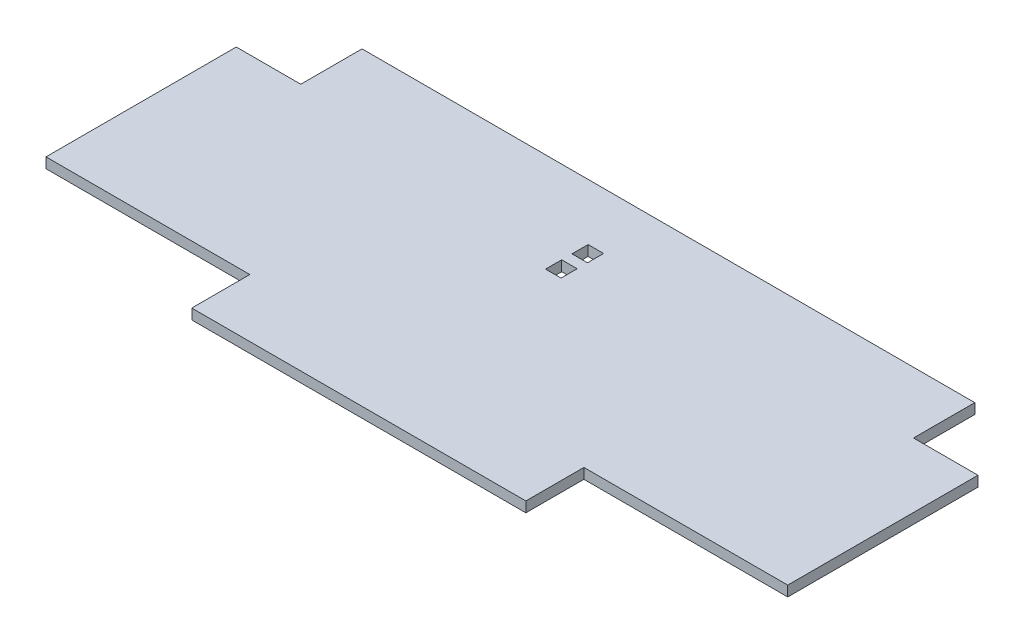
ISO-10303-21;
HEADER;
FILE_DESCRIPTION(('STEP AP214'),'2;1');
FILE_NAME('part.step','',(''),(''),'','','');
FILE_SCHEMA(('AUTOMOTIVE_DESIGN { 1 0 10303 214 1 1 1 1 }'));
ENDSEC;
DATA;
#1=APPLICATION_CONTEXT('core data for automotive mechanical design processes');
#2=APPLICATION_PROTOCOL_DEFINITION('international standard','automotive_design',2000,#1);
#3=PRODUCT_CONTEXT('',#1,'mechanical');
#4=PRODUCT('Part','Part','',(#3));
#5=PRODUCT_RELATED_PRODUCT_CATEGORY('part','',(#4));
#6=PRODUCT_DEFINITION_FORMATION('','',#4);
#7=PRODUCT_DEFINITION_CONTEXT('part definition',#1,'design');
#8=PRODUCT_DEFINITION('design','',#6,#7);
#9=PRODUCT_DEFINITION_SHAPE('','',#8);
#10=(LENGTH_UNIT() NAMED_UNIT(*) SI_UNIT(.MILLI.,.METRE.));
#11=(NAMED_UNIT(*) PLANE_ANGLE_UNIT() SI_UNIT($,.RADIAN.));
#12=(NAMED_UNIT(*) SI_UNIT($,.STERADIAN.) SOLID_ANGLE_UNIT());
#13=UNCERTAINTY_MEASURE_WITH_UNIT(LENGTH_MEASURE(1.E-05),#10,'distance_accuracy_value','');
#14=(GEOMETRIC_REPRESENTATION_CONTEXT(3) GLOBAL_UNCERTAINTY_ASSIGNED_CONTEXT((#13)) GLOBAL_UNIT_ASSIGNED_CONTEXT((#10,
#11,#12)) REPRESENTATION_CONTEXT('',''));
#15=CARTESIAN_POINT('',(0.,0.,0.));
#16=DIRECTION('',(0.,0.,1.));
#17=DIRECTION('',(1.,0.,0.));
#18=AXIS2_PLACEMENT_3D('',#15,#16,#17);
#19=CARTESIAN_POINT('',(-115.,1.6,-38.5));
#20=DIRECTION('',(1.,0.,0.));
#21=DIRECTION('',(0.,0.,-1.));
#22=AXIS2_PLACEMENT_3D('',#19,#20,#21);
#23=PLANE('',#22);
#24=DIRECTION('',(0.,0.,1.));
#25=VECTOR('',#24,1.);
#26=CARTESIAN_POINT('',(-115.,0.,-38.5));
#27=LINE('',#26,#25);
#28=CARTESIAN_POINT('',(-115.,0.,-38.5));
#29=VERTEX_POINT('',#28);
#30=CARTESIAN_POINT('',(-115.,0.,-8.99999999999999));
#31=VERTEX_POINT('',#30);
#32=EDGE_CURVE('E213',#29,#31,#27,.T.);
#33=ORIENTED_EDGE('',*,*,#32,.T.);
#34=DIRECTION('',(0.,-1.,0.));
#35=VECTOR('',#34,1.);
#36=CARTESIAN_POINT('',(-115.,1.6,-8.99999999999999));
#37=LINE('',#36,#35);
#38=CARTESIAN_POINT('',(-115.,1.6,-8.99999999999999));
#39=VERTEX_POINT('',#38);
#40=EDGE_CURVE('E302',#39,#31,#37,.T.);
#41=ORIENTED_EDGE('',*,*,#40,.F.);
#42=DIRECTION('',(0.,0.,1.));
#43=VECTOR('',#42,1.);
#44=CARTESIAN_POINT('',(-115.,1.6,-38.5));
#45=LINE('',#44,#43);
#46=CARTESIAN_POINT('',(-115.,1.6,-38.5));
#47=VERTEX_POINT('',#46);
#48=EDGE_CURVE('E220',#47,#39,#45,.T.);
#49=ORIENTED_EDGE('',*,*,#48,.F.);
#50=DIRECTION('',(0.,-1.,0.));
#51=VECTOR('',#50,1.);
#52=CARTESIAN_POINT('',(-115.,1.6,-38.5));
#53=LINE('',#52,#51);
#54=EDGE_CURVE('E246',#47,#29,#53,.T.);
#55=ORIENTED_EDGE('',*,*,#54,.T.);
#56=EDGE_LOOP('',(#33,#41,#49,#55));
#57=FACE_BOUND('',#56,.T.);
#58=ADVANCED_FACE('F35',(#57),#23,.F.);
#59=CARTESIAN_POINT('',(-115.,1.6,-8.99999999999999));
#60=DIRECTION('',(0.,0.,-1.));
#61=DIRECTION('',(-1.,0.,0.));
#62=AXIS2_PLACEMENT_3D('',#59,#60,#61);
#63=PLANE('',#62);
#64=DIRECTION('',(1.,0.,0.));
#65=VECTOR('',#64,1.);
#66=CARTESIAN_POINT('',(-115.,0.,-8.99999999999999));
#67=LINE('',#66,#65);
#68=CARTESIAN_POINT('',(-83.4,0.,-8.99999999999999));
#69=VERTEX_POINT('',#68);
#70=EDGE_CURVE('E249',#31,#69,#67,.T.);
#71=ORIENTED_EDGE('',*,*,#70,.T.);
#72=DIRECTION('',(0.,-1.,0.));
#73=VECTOR('',#72,1.);
#74=CARTESIAN_POINT('',(-83.4,1.6,-8.99999999999999));
#75=LINE('',#74,#73);
#76=CARTESIAN_POINT('',(-83.4,1.6,-8.99999999999999));
#77=VERTEX_POINT('',#76);
#78=EDGE_CURVE('E299',#77,#69,#75,.T.);
#79=ORIENTED_EDGE('',*,*,#78,.F.);
#80=DIRECTION('',(1.,0.,0.));
#81=VECTOR('',#80,1.);
#82=CARTESIAN_POINT('',(-115.,1.6,-8.99999999999999));
#83=LINE('',#82,#81);
#84=EDGE_CURVE('E223',#39,#77,#83,.T.);
#85=ORIENTED_EDGE('',*,*,#84,.F.);
#86=ORIENTED_EDGE('',*,*,#40,.T.);
#87=EDGE_LOOP('',(#71,#79,#85,#86));
#88=FACE_BOUND('',#87,.T.);
#89=ADVANCED_FACE('F341',(#88),#63,.F.);
#90=CARTESIAN_POINT('',(-83.4,1.6,-8.99999999999999));
#91=DIRECTION('',(1.,0.,0.));
#92=DIRECTION('',(0.,0.,-1.));
#93=AXIS2_PLACEMENT_3D('',#90,#91,#92);
#94=PLANE('',#93);
#95=DIRECTION('',(0.,0.,1.));
#96=VECTOR('',#95,1.);
#97=CARTESIAN_POINT('',(-83.4,0.,-8.99999999999999));
#98=LINE('',#97,#96);
#99=CARTESIAN_POINT('',(-83.4,0.,0.));
#100=VERTEX_POINT('',#99);
#101=EDGE_CURVE('E251',#69,#100,#98,.T.);
#102=ORIENTED_EDGE('',*,*,#101,.T.);
#103=DIRECTION('',(0.,-1.,0.));
#104=VECTOR('',#103,1.);
#105=CARTESIAN_POINT('',(-83.4,1.6,0.));
#106=LINE('',#105,#104);
#107=CARTESIAN_POINT('',(-83.4,1.6,0.));
#108=VERTEX_POINT('',#107);
#109=EDGE_CURVE('E296',#108,#100,#106,.T.);
#110=ORIENTED_EDGE('',*,*,#109,.F.);
#111=DIRECTION('',(0.,0.,1.));
#112=VECTOR('',#111,1.);
#113=CARTESIAN_POINT('',(-83.4,1.6,-8.99999999999999));
#114=LINE('',#113,#112);
#115=EDGE_CURVE('E226',#77,#108,#114,.T.);
#116=ORIENTED_EDGE('',*,*,#115,.F.);
#117=ORIENTED_EDGE('',*,*,#78,.T.);
#118=EDGE_LOOP('',(#102,#110,#116,#117));
#119=FACE_BOUND('',#118,.T.);
#120=ADVANCED_FACE('F346',(#119),#94,.F.);
#121=CARTESIAN_POINT('',(-83.4,1.6,0.));
#122=DIRECTION('',(0.,0.,-1.));
#123=DIRECTION('',(-1.,0.,0.));
#124=AXIS2_PLACEMENT_3D('',#121,#122,#123);
#125=PLANE('',#124);
#126=DIRECTION('',(1.,0.,0.));
#127=VECTOR('',#126,1.);
#128=CARTESIAN_POINT('',(-83.4,0.,0.));
#129=LINE('',#128,#127);
#130=CARTESIAN_POINT('',(-31.6,0.,0.));
#131=VERTEX_POINT('',#130);
#132=EDGE_CURVE('E253',#100,#131,#129,.T.);
#133=ORIENTED_EDGE('',*,*,#132,.T.);
#134=DIRECTION('',(0.,-1.,0.));
#135=VECTOR('',#134,1.);
#136=CARTESIAN_POINT('',(-31.6,1.6,0.));
#137=LINE('',#136,#135);
#138=CARTESIAN_POINT('',(-31.6,1.6,0.));
#139=VERTEX_POINT('',#138);
#140=EDGE_CURVE('E293',#139,#131,#137,.T.);
#141=ORIENTED_EDGE('',*,*,#140,.F.);
#142=DIRECTION('',(1.,0.,0.));
#143=VECTOR('',#142,1.);
#144=CARTESIAN_POINT('',(-83.4,1.6,0.));
#145=LINE('',#144,#143);
#146=EDGE_CURVE('E228',#108,#139,#145,.T.);
#147=ORIENTED_EDGE('',*,*,#146,.F.);
#148=ORIENTED_EDGE('',*,*,#109,.T.);
#149=EDGE_LOOP('',(#133,#141,#147,#148));
#150=FACE_BOUND('',#149,.T.);
#151=ADVANCED_FACE('F399',(#150),#125,.F.);
#152=CARTESIAN_POINT('',(-31.6,1.6,-8.99999999999999));
#153=DIRECTION('',(-1.,0.,0.));
#154=DIRECTION('',(0.,0.,1.));
#155=AXIS2_PLACEMENT_3D('',#152,#153,#154);
#156=PLANE('',#155);
#157=DIRECTION('',(0.,0.,-1.));
#158=VECTOR('',#157,1.);
#159=CARTESIAN_POINT('',(-31.6,0.,-8.99999999999999));
#160=LINE('',#159,#158);
#161=CARTESIAN_POINT('',(-31.6,0.,-8.99999999999999));
#162=VERTEX_POINT('',#161);
#163=EDGE_CURVE('E255',#131,#162,#160,.T.);
#164=ORIENTED_EDGE('',*,*,#163,.T.);
#165=DIRECTION('',(0.,-1.,0.));
#166=VECTOR('',#165,1.);
#167=CARTESIAN_POINT('',(-31.6,1.6,-8.99999999999999));
#168=LINE('',#167,#166);
#169=CARTESIAN_POINT('',(-31.6,1.6,-8.99999999999999));
#170=VERTEX_POINT('',#169);
#171=EDGE_CURVE('E290',#170,#162,#168,.T.);
#172=ORIENTED_EDGE('',*,*,#171,.F.);
#173=DIRECTION('',(0.,0.,-1.));
#174=VECTOR('',#173,1.);
#175=CARTESIAN_POINT('',(-31.6,1.6,-8.99999999999999));
#176=LINE('',#175,#174);
#177=EDGE_CURVE('E230',#139,#170,#176,.T.);
#178=ORIENTED_EDGE('',*,*,#177,.F.);
#179=ORIENTED_EDGE('',*,*,#140,.T.);
#180=EDGE_LOOP('',(#164,#172,#178,#179));
#181=FACE_BOUND('',#180,.T.);
#182=ADVANCED_FACE('F396',(#181),#156,.F.);
#183=CARTESIAN_POINT('',(0.,1.6,-9.));
#184=DIRECTION('',(0.,0.,-1.));
#185=DIRECTION('',(-1.,0.,0.));
#186=AXIS2_PLACEMENT_3D('',#183,#184,#185);
#187=PLANE('',#186);
#188=DIRECTION('',(1.,0.,0.));
#189=VECTOR('',#188,1.);
#190=CARTESIAN_POINT('',(0.,0.,-9.));
#191=LINE('',#190,#189);
#192=CARTESIAN_POINT('',(0.,0.,-9.));
#193=VERTEX_POINT('',#192);
#194=EDGE_CURVE('E257',#162,#193,#191,.T.);
#195=ORIENTED_EDGE('',*,*,#194,.T.);
#196=DIRECTION('',(0.,-1.,0.));
#197=VECTOR('',#196,1.);
#198=CARTESIAN_POINT('',(0.,1.6,-9.));
#199=LINE('',#198,#197);
#200=CARTESIAN_POINT('',(0.,1.6,-9.));
#201=VERTEX_POINT('',#200);
#202=EDGE_CURVE('E287',#201,#193,#199,.T.);
#203=ORIENTED_EDGE('',*,*,#202,.F.);
#204=DIRECTION('',(1.,0.,0.));
#205=VECTOR('',#204,1.);
#206=CARTESIAN_POINT('',(0.,1.6,-9.));
#207=LINE('',#206,#205);
#208=EDGE_CURVE('E232',#170,#201,#207,.T.);
#209=ORIENTED_EDGE('',*,*,#208,.F.);
#210=ORIENTED_EDGE('',*,*,#171,.T.);
#211=EDGE_LOOP('',(#195,#203,#209,#210));
#212=FACE_BOUND('',#211,.T.);
#213=ADVANCED_FACE('F392',(#212),#187,.F.);
#214=CARTESIAN_POINT('',(0.,1.6,-38.5));
#215=DIRECTION('',(-1.,0.,0.));
#216=DIRECTION('',(0.,0.,1.));
#217=AXIS2_PLACEMENT_3D('',#214,#215,#216);
#218=PLANE('',#217);
#219=DIRECTION('',(0.,0.,-1.));
#220=VECTOR('',#219,1.);
#221=CARTESIAN_POINT('',(0.,0.,-38.5));
#222=LINE('',#221,#220);
#223=CARTESIAN_POINT('',(0.,0.,-38.5));
#224=VERTEX_POINT('',#223);
#225=EDGE_CURVE('E259',#193,#224,#222,.T.);
#226=ORIENTED_EDGE('',*,*,#225,.T.);
#227=DIRECTION('',(0.,-1.,0.));
#228=VECTOR('',#227,1.);
#229=CARTESIAN_POINT('',(0.,1.6,-38.5));
#230=LINE('',#229,#228);
#231=CARTESIAN_POINT('',(0.,1.6,-38.5));
#232=VERTEX_POINT('',#231);
#233=EDGE_CURVE('E284',#232,#224,#230,.T.);
#234=ORIENTED_EDGE('',*,*,#233,.F.);
#235=DIRECTION('',(0.,0.,-1.));
#236=VECTOR('',#235,1.);
#237=CARTESIAN_POINT('',(0.,1.6,-38.5));
#238=LINE('',#237,#236);
#239=EDGE_CURVE('E234',#201,#232,#238,.T.);
#240=ORIENTED_EDGE('',*,*,#239,.F.);
#241=ORIENTED_EDGE('',*,*,#202,.T.);
#242=EDGE_LOOP('',(#226,#234,#240,#241));
#243=FACE_BOUND('',#242,.T.);
#244=ADVANCED_FACE('F387',(#243),#218,.F.);
#245=CARTESIAN_POINT('',(-9.99999999999999,1.6,-38.5));
#246=DIRECTION('',(0.,0.,1.));
#247=DIRECTION('',(1.,0.,0.));
#248=AXIS2_PLACEMENT_3D('',#245,#246,#247);
#249=PLANE('',#248);
#250=DIRECTION('',(-1.,0.,0.));
#251=VECTOR('',#250,1.);
#252=CARTESIAN_POINT('',(-9.99999999999999,0.,-38.5));
#253=LINE('',#252,#251);
#254=CARTESIAN_POINT('',(-9.99999999999999,0.,-38.5));
#255=VERTEX_POINT('',#254);
#256=EDGE_CURVE('E261',#224,#255,#253,.T.);
#257=ORIENTED_EDGE('',*,*,#256,.T.);
#258=DIRECTION('',(0.,-1.,0.));
#259=VECTOR('',#258,1.);
#260=CARTESIAN_POINT('',(-9.99999999999999,1.6,-38.5));
#261=LINE('',#260,#259);
#262=CARTESIAN_POINT('',(-9.99999999999999,1.6,-38.5));
#263=VERTEX_POINT('',#262);
#264=EDGE_CURVE('E281',#263,#255,#261,.T.);
#265=ORIENTED_EDGE('',*,*,#264,.F.);
#266=DIRECTION('',(-1.,0.,0.));
#267=VECTOR('',#266,1.);
#268=CARTESIAN_POINT('',(-9.99999999999999,1.6,-38.5));
#269=LINE('',#268,#267);
#270=EDGE_CURVE('E236',#232,#263,#269,.T.);
#271=ORIENTED_EDGE('',*,*,#270,.F.);
#272=ORIENTED_EDGE('',*,*,#233,.T.);
#273=EDGE_LOOP('',(#257,#265,#271,#272));
#274=FACE_BOUND('',#273,.T.);
#275=ADVANCED_FACE('F381',(#274),#249,.F.);
#276=CARTESIAN_POINT('',(-9.99999999999999,1.6,-48.));
#277=DIRECTION('',(-1.,0.,0.));
#278=DIRECTION('',(0.,0.,1.));
#279=AXIS2_PLACEMENT_3D('',#276,#277,#278);
#280=PLANE('',#279);
#281=DIRECTION('',(0.,0.,-1.));
#282=VECTOR('',#281,1.);
#283=CARTESIAN_POINT('',(-9.99999999999999,0.,-48.));
#284=LINE('',#283,#282);
#285=CARTESIAN_POINT('',(-9.99999999999999,0.,-48.));
#286=VERTEX_POINT('',#285);
#287=EDGE_CURVE('E263',#255,#286,#284,.T.);
#288=ORIENTED_EDGE('',*,*,#287,.T.);
#289=DIRECTION('',(0.,-1.,0.));
#290=VECTOR('',#289,1.);
#291=CARTESIAN_POINT('',(-9.99999999999999,1.6,-48.));
#292=LINE('',#291,#290);
#293=CARTESIAN_POINT('',(-9.99999999999999,1.6,-48.));
#294=VERTEX_POINT('',#293);
#295=EDGE_CURVE('E278',#294,#286,#292,.T.);
#296=ORIENTED_EDGE('',*,*,#295,.F.);
#297=DIRECTION('',(0.,0.,-1.));
#298=VECTOR('',#297,1.);
#299=CARTESIAN_POINT('',(-9.99999999999999,1.6,-48.));
#300=LINE('',#299,#298);
#301=EDGE_CURVE('E238',#263,#294,#300,.T.);
#302=ORIENTED_EDGE('',*,*,#301,.F.);
#303=ORIENTED_EDGE('',*,*,#264,.T.);
#304=EDGE_LOOP('',(#288,#296,#302,#303));
#305=FACE_BOUND('',#304,.T.);
#306=ADVANCED_FACE('F377',(#305),#280,.F.);
#307=CARTESIAN_POINT('',(-105.,1.6,-48.));
#308=DIRECTION('',(0.,0.,1.));
#309=DIRECTION('',(1.,0.,0.));
#310=AXIS2_PLACEMENT_3D('',#307,#308,#309);
#311=PLANE('',#310);
#312=DIRECTION('',(-1.,0.,0.));
#313=VECTOR('',#312,1.);
#314=CARTESIAN_POINT('',(-105.,0.,-48.));
#315=LINE('',#314,#313);
#316=CARTESIAN_POINT('',(-105.,0.,-48.));
#317=VERTEX_POINT('',#316);
#318=EDGE_CURVE('E265',#286,#317,#315,.T.);
#319=ORIENTED_EDGE('',*,*,#318,.T.);
#320=DIRECTION('',(0.,-1.,0.));
#321=VECTOR('',#320,1.);
#322=CARTESIAN_POINT('',(-105.,1.6,-48.));
#323=LINE('',#322,#321);
#324=CARTESIAN_POINT('',(-105.,1.6,-48.));
#325=VERTEX_POINT('',#324);
#326=EDGE_CURVE('E275',#325,#317,#323,.T.);
#327=ORIENTED_EDGE('',*,*,#326,.F.);
#328=DIRECTION('',(-1.,0.,0.));
#329=VECTOR('',#328,1.);
#330=CARTESIAN_POINT('',(-105.,1.6,-48.));
#331=LINE('',#330,#329);
#332=EDGE_CURVE('E240',#294,#325,#331,.T.);
#333=ORIENTED_EDGE('',*,*,#332,.F.);
#334=ORIENTED_EDGE('',*,*,#295,.T.);
#335=EDGE_LOOP('',(#319,#327,#333,#334));
#336=FACE_BOUND('',#335,.T.);
#337=ADVANCED_FACE('F372',(#336),#311,.F.);
#338=CARTESIAN_POINT('',(-105.,1.6,-38.5));
#339=DIRECTION('',(1.,0.,0.));
#340=DIRECTION('',(0.,0.,-1.));
#341=AXIS2_PLACEMENT_3D('',#338,#339,#340);
#342=PLANE('',#341);
#343=DIRECTION('',(0.,0.,1.));
#344=VECTOR('',#343,1.);
#345=CARTESIAN_POINT('',(-105.,0.,-38.5));
#346=LINE('',#345,#344);
#347=CARTESIAN_POINT('',(-105.,0.,-38.5));
#348=VERTEX_POINT('',#347);
#349=EDGE_CURVE('E267',#317,#348,#346,.T.);
#350=ORIENTED_EDGE('',*,*,#349,.T.);
#351=DIRECTION('',(0.,-1.,0.));
#352=VECTOR('',#351,1.);
#353=CARTESIAN_POINT('',(-105.,1.6,-38.5));
#354=LINE('',#353,#352);
#355=CARTESIAN_POINT('',(-105.,1.6,-38.5));
#356=VERTEX_POINT('',#355);
#357=EDGE_CURVE('E272',#356,#348,#354,.T.);
#358=ORIENTED_EDGE('',*,*,#357,.F.);
#359=DIRECTION('',(0.,0.,1.));
#360=VECTOR('',#359,1.);
#361=CARTESIAN_POINT('',(-105.,1.6,-38.5));
#362=LINE('',#361,#360);
#363=EDGE_CURVE('E242',#325,#356,#362,.T.);
#364=ORIENTED_EDGE('',*,*,#363,.F.);
#365=ORIENTED_EDGE('',*,*,#326,.T.);
#366=EDGE_LOOP('',(#350,#358,#364,#365));
#367=FACE_BOUND('',#366,.T.);
#368=ADVANCED_FACE('F366',(#367),#342,.F.);
#369=CARTESIAN_POINT('',(-115.,1.6,-38.5));
#370=DIRECTION('',(0.,0.,1.));
#371=DIRECTION('',(1.,0.,0.));
#372=AXIS2_PLACEMENT_3D('',#369,#370,#371);
#373=PLANE('',#372);
#374=DIRECTION('',(-1.,0.,0.));
#375=VECTOR('',#374,1.);
#376=CARTESIAN_POINT('',(-115.,0.,-38.5));
#377=LINE('',#376,#375);
#378=EDGE_CURVE('E224',#348,#29,#377,.T.);
#379=ORIENTED_EDGE('',*,*,#378,.T.);
#380=ORIENTED_EDGE('',*,*,#54,.F.);
#381=DIRECTION('',(-1.,0.,0.));
#382=VECTOR('',#381,1.);
#383=CARTESIAN_POINT('',(-115.,1.6,-38.5));
#384=LINE('',#383,#382);
#385=EDGE_CURVE('E244',#356,#47,#384,.T.);
#386=ORIENTED_EDGE('',*,*,#385,.F.);
#387=ORIENTED_EDGE('',*,*,#357,.T.);
#388=EDGE_LOOP('',(#379,#380,#386,#387));
#389=FACE_BOUND('',#388,.T.);
#390=ADVANCED_FACE('F364',(#389),#373,.F.);
#391=CARTESIAN_POINT('',(0.,1.6,0.));
#392=DIRECTION('',(0.,1.,0.));
#393=DIRECTION('',(0.,0.,1.));
#394=AXIS2_PLACEMENT_3D('',#391,#392,#393);
#395=PLANE('',#394);
#396=DIRECTION('',(1.,0.,0.));
#397=VECTOR('',#396,1.);
#398=CARTESIAN_POINT('',(-58.8,1.6,-32.65));
#399=LINE('',#398,#397);
#400=CARTESIAN_POINT('',(-61.2,1.6,-32.65));
#401=VERTEX_POINT('',#400);
#402=CARTESIAN_POINT('',(-58.8,1.6,-32.65));
#403=VERTEX_POINT('',#402);
#404=EDGE_CURVE('E49',#401,#403,#399,.T.);
#405=ORIENTED_EDGE('',*,*,#404,.F.);
#406=DIRECTION('',(0.,0.,1.));
#407=VECTOR('',#406,1.);
#408=CARTESIAN_POINT('',(-61.2,1.6,-35.15));
#409=LINE('',#408,#407);
#410=CARTESIAN_POINT('',(-61.2,1.6,-35.15));
#411=VERTEX_POINT('',#410);
#412=EDGE_CURVE('E190',#411,#401,#409,.T.);
#413=ORIENTED_EDGE('',*,*,#412,.F.);
#414=DIRECTION('',(-1.,0.,0.));
#415=VECTOR('',#414,1.);
#416=CARTESIAN_POINT('',(-61.2,1.6,-35.15));
#417=LINE('',#416,#415);
#418=CARTESIAN_POINT('',(-58.8,1.6,-35.15));
#419=VERTEX_POINT('',#418);
#420=EDGE_CURVE('E174',#419,#411,#417,.T.);
#421=ORIENTED_EDGE('',*,*,#420,.F.);
#422=DIRECTION('',(0.,0.,-1.));
#423=VECTOR('',#422,1.);
#424=CARTESIAN_POINT('',(-58.8,1.6,-32.65));
#425=LINE('',#424,#423);
#426=EDGE_CURVE('E183',#403,#419,#425,.T.);
#427=ORIENTED_EDGE('',*,*,#426,.F.);
#428=EDGE_LOOP('',(#405,#413,#421,#427));
#429=FACE_BOUND('',#428,.T.);
#430=DIRECTION('',(-1.,0.,0.));
#431=VECTOR('',#430,1.);
#432=CARTESIAN_POINT('',(-58.8,1.6,-39.25));
#433=LINE('',#432,#431);
#434=CARTESIAN_POINT('',(-58.8,1.6,-39.25));
#435=VERTEX_POINT('',#434);
#436=CARTESIAN_POINT('',(-61.2,1.6,-39.25));
#437=VERTEX_POINT('',#436);
#438=EDGE_CURVE('E197',#435,#437,#433,.T.);
#439=ORIENTED_EDGE('',*,*,#438,.F.);
#440=DIRECTION('',(0.,0.,-1.));
#441=VECTOR('',#440,1.);
#442=CARTESIAN_POINT('',(-58.8,1.6,-36.75));
#443=LINE('',#442,#441);
#444=CARTESIAN_POINT('',(-58.8,1.6,-36.75));
#445=VERTEX_POINT('',#444);
#446=EDGE_CURVE('E207',#445,#435,#443,.T.);
#447=ORIENTED_EDGE('',*,*,#446,.F.);
#448=DIRECTION('',(1.,0.,0.));
#449=VECTOR('',#448,1.);
#450=CARTESIAN_POINT('',(-58.8,1.6,-36.75));
#451=LINE('',#450,#449);
#452=CARTESIAN_POINT('',(-61.2,1.6,-36.75));
#453=VERTEX_POINT('',#452);
#454=EDGE_CURVE('E204',#453,#445,#451,.T.);
#455=ORIENTED_EDGE('',*,*,#454,.F.);
#456=DIRECTION('',(0.,0.,1.));
#457=VECTOR('',#456,1.);
#458=CARTESIAN_POINT('',(-61.2,1.6,-36.75));
#459=LINE('',#458,#457);
#460=EDGE_CURVE('E201',#437,#453,#459,.T.);
#461=ORIENTED_EDGE('',*,*,#460,.F.);
#462=EDGE_LOOP('',(#439,#447,#455,#461));
#463=FACE_BOUND('',#462,.T.);
#464=ORIENTED_EDGE('',*,*,#48,.T.);
#465=ORIENTED_EDGE('',*,*,#84,.T.);
#466=ORIENTED_EDGE('',*,*,#115,.T.);
#467=ORIENTED_EDGE('',*,*,#146,.T.);
#468=ORIENTED_EDGE('',*,*,#177,.T.);
#469=ORIENTED_EDGE('',*,*,#208,.T.);
#470=ORIENTED_EDGE('',*,*,#239,.T.);
#471=ORIENTED_EDGE('',*,*,#270,.T.);
#472=ORIENTED_EDGE('',*,*,#301,.T.);
#473=ORIENTED_EDGE('',*,*,#332,.T.);
#474=ORIENTED_EDGE('',*,*,#363,.T.);
#475=ORIENTED_EDGE('',*,*,#385,.T.);
#476=EDGE_LOOP('',(#464,#465,#466,#467,#468,#469,#470,#471,#472,#473,#474,#475));
#477=FACE_BOUND('',#476,.T.);
#478=ADVANCED_FACE('F187',(#429,#463,#477),#395,.T.);
#479=CARTESIAN_POINT('',(0.,0.,0.));
#480=DIRECTION('',(0.,1.,0.));
#481=DIRECTION('',(0.,0.,1.));
#482=AXIS2_PLACEMENT_3D('',#479,#480,#481);
#483=PLANE('',#482);
#484=DIRECTION('',(0.,0.,1.));
#485=VECTOR('',#484,1.);
#486=CARTESIAN_POINT('',(-61.2,0.,0.));
#487=LINE('',#486,#485);
#488=CARTESIAN_POINT('',(-61.2,0.,-35.15));
#489=VERTEX_POINT('',#488);
#490=CARTESIAN_POINT('',(-61.2,0.,-32.65));
#491=VERTEX_POINT('',#490);
#492=EDGE_CURVE('E42',#489,#491,#487,.T.);
#493=ORIENTED_EDGE('',*,*,#492,.T.);
#494=DIRECTION('',(1.,0.,0.));
#495=VECTOR('',#494,1.);
#496=CARTESIAN_POINT('',(0.,0.,-32.65));
#497=LINE('',#496,#495);
#498=CARTESIAN_POINT('',(-58.8,0.,-32.65));
#499=VERTEX_POINT('',#498);
#500=EDGE_CURVE('E11',#491,#499,#497,.T.);
#501=ORIENTED_EDGE('',*,*,#500,.T.);
#502=DIRECTION('',(0.,0.,-1.));
#503=VECTOR('',#502,1.);
#504=CARTESIAN_POINT('',(-58.8,0.,0.));
#505=LINE('',#504,#503);
#506=CARTESIAN_POINT('',(-58.8,0.,-35.15));
#507=VERTEX_POINT('',#506);
#508=EDGE_CURVE('E317',#499,#507,#505,.T.);
#509=ORIENTED_EDGE('',*,*,#508,.T.);
#510=DIRECTION('',(-1.,0.,0.));
#511=VECTOR('',#510,1.);
#512=CARTESIAN_POINT('',(0.,0.,-35.15));
#513=LINE('',#512,#511);
#514=EDGE_CURVE('E177',#507,#489,#513,.T.);
#515=ORIENTED_EDGE('',*,*,#514,.T.);
#516=EDGE_LOOP('',(#493,#501,#509,#515));
#517=FACE_BOUND('',#516,.T.);
#518=DIRECTION('',(0.,0.,-1.));
#519=VECTOR('',#518,1.);
#520=CARTESIAN_POINT('',(-58.8,0.,0.));
#521=LINE('',#520,#519);
#522=CARTESIAN_POINT('',(-58.8,0.,-36.75));
#523=VERTEX_POINT('',#522);
#524=CARTESIAN_POINT('',(-58.8,0.,-39.25));
#525=VERTEX_POINT('',#524);
#526=EDGE_CURVE('E311',#523,#525,#521,.T.);
#527=ORIENTED_EDGE('',*,*,#526,.T.);
#528=DIRECTION('',(-1.,0.,0.));
#529=VECTOR('',#528,1.);
#530=CARTESIAN_POINT('',(0.,0.,-39.25));
#531=LINE('',#530,#529);
#532=CARTESIAN_POINT('',(-61.2,0.,-39.25));
#533=VERTEX_POINT('',#532);
#534=EDGE_CURVE('E314',#525,#533,#531,.T.);
#535=ORIENTED_EDGE('',*,*,#534,.T.);
#536=DIRECTION('',(0.,0.,1.));
#537=VECTOR('',#536,1.);
#538=CARTESIAN_POINT('',(-61.2,0.,0.));
#539=LINE('',#538,#537);
#540=CARTESIAN_POINT('',(-61.2,0.,-36.75));
#541=VERTEX_POINT('',#540);
#542=EDGE_CURVE('E305',#533,#541,#539,.T.);
#543=ORIENTED_EDGE('',*,*,#542,.T.);
#544=DIRECTION('',(1.,0.,0.));
#545=VECTOR('',#544,1.);
#546=CARTESIAN_POINT('',(0.,0.,-36.75));
#547=LINE('',#546,#545);
#548=EDGE_CURVE('E308',#541,#523,#547,.T.);
#549=ORIENTED_EDGE('',*,*,#548,.T.);
#550=EDGE_LOOP('',(#527,#535,#543,#549));
#551=FACE_BOUND('',#550,.T.);
#552=ORIENTED_EDGE('',*,*,#32,.F.);
#553=ORIENTED_EDGE('',*,*,#378,.F.);
#554=ORIENTED_EDGE('',*,*,#349,.F.);
#555=ORIENTED_EDGE('',*,*,#318,.F.);
#556=ORIENTED_EDGE('',*,*,#287,.F.);
#557=ORIENTED_EDGE('',*,*,#256,.F.);
#558=ORIENTED_EDGE('',*,*,#225,.F.);
#559=ORIENTED_EDGE('',*,*,#194,.F.);
#560=ORIENTED_EDGE('',*,*,#163,.F.);
#561=ORIENTED_EDGE('',*,*,#132,.F.);
#562=ORIENTED_EDGE('',*,*,#101,.F.);
#563=ORIENTED_EDGE('',*,*,#70,.F.);
#564=EDGE_LOOP('',(#552,#553,#554,#555,#556,#557,#558,#559,#560,#561,#562,#563));
#565=FACE_BOUND('',#564,.T.);
#566=ADVANCED_FACE('F321',(#517,#551,#565),#483,.F.);
#567=CARTESIAN_POINT('',(-58.8,-8.4,-39.25));
#568=DIRECTION('',(0.,0.,-1.));
#569=DIRECTION('',(-1.,0.,0.));
#570=AXIS2_PLACEMENT_3D('',#567,#568,#569);
#571=PLANE('',#570);
#572=DIRECTION('',(0.,1.,0.));
#573=VECTOR('',#572,1.);
#574=CARTESIAN_POINT('',(-58.8,-8.4,-39.25));
#575=LINE('',#574,#573);
#576=EDGE_CURVE('E211',#525,#435,#575,.T.);
#577=ORIENTED_EDGE('',*,*,#576,.T.);
#578=ORIENTED_EDGE('',*,*,#438,.T.);
#579=DIRECTION('',(0.,1.,0.));
#580=VECTOR('',#579,1.);
#581=CARTESIAN_POINT('',(-61.2,-8.4,-39.25));
#582=LINE('',#581,#580);
#583=EDGE_CURVE('E210',#533,#437,#582,.T.);
#584=ORIENTED_EDGE('',*,*,#583,.F.);
#585=ORIENTED_EDGE('',*,*,#534,.F.);
#586=EDGE_LOOP('',(#577,#578,#584,#585));
#587=FACE_BOUND('',#586,.T.);
#588=ADVANCED_FACE('F428',(#587),#571,.F.);
#589=CARTESIAN_POINT('',(-58.8,-8.4,-36.75));
#590=DIRECTION('',(1.,0.,0.));
#591=DIRECTION('',(0.,0.,-1.));
#592=AXIS2_PLACEMENT_3D('',#589,#590,#591);
#593=PLANE('',#592);
#594=DIRECTION('',(0.,1.,0.));
#595=VECTOR('',#594,1.);
#596=CARTESIAN_POINT('',(-58.8,-8.4,-36.75));
#597=LINE('',#596,#595);
#598=EDGE_CURVE('E214',#523,#445,#597,.T.);
#599=ORIENTED_EDGE('',*,*,#598,.T.);
#600=ORIENTED_EDGE('',*,*,#446,.T.);
#601=ORIENTED_EDGE('',*,*,#576,.F.);
#602=ORIENTED_EDGE('',*,*,#526,.F.);
#603=EDGE_LOOP('',(#599,#600,#601,#602));
#604=FACE_BOUND('',#603,.T.);
#605=ADVANCED_FACE('F432',(#604),#593,.F.);
#606=CARTESIAN_POINT('',(-58.8,-8.4,-36.75));
#607=DIRECTION('',(0.,0.,1.));
#608=DIRECTION('',(1.,0.,0.));
#609=AXIS2_PLACEMENT_3D('',#606,#607,#608);
#610=PLANE('',#609);
#611=DIRECTION('',(0.,1.,0.));
#612=VECTOR('',#611,1.);
#613=CARTESIAN_POINT('',(-61.2,-8.4,-36.75));
#614=LINE('',#613,#612);
#615=EDGE_CURVE('E216',#541,#453,#614,.T.);
#616=ORIENTED_EDGE('',*,*,#615,.T.);
#617=ORIENTED_EDGE('',*,*,#454,.T.);
#618=ORIENTED_EDGE('',*,*,#598,.F.);
#619=ORIENTED_EDGE('',*,*,#548,.F.);
#620=EDGE_LOOP('',(#616,#617,#618,#619));
#621=FACE_BOUND('',#620,.T.);
#622=ADVANCED_FACE('F335',(#621),#610,.F.);
#623=CARTESIAN_POINT('',(-61.2,-8.4,-36.75));
#624=DIRECTION('',(-1.,0.,0.));
#625=DIRECTION('',(0.,0.,1.));
#626=AXIS2_PLACEMENT_3D('',#623,#624,#625);
#627=PLANE('',#626);
#628=ORIENTED_EDGE('',*,*,#583,.T.);
#629=ORIENTED_EDGE('',*,*,#460,.T.);
#630=ORIENTED_EDGE('',*,*,#615,.F.);
#631=ORIENTED_EDGE('',*,*,#542,.F.);
#632=EDGE_LOOP('',(#628,#629,#630,#631));
#633=FACE_BOUND('',#632,.T.);
#634=ADVANCED_FACE('F328',(#633),#627,.F.);
#635=CARTESIAN_POINT('',(-58.8,-8.4,-32.65));
#636=DIRECTION('',(0.,0.,1.));
#637=DIRECTION('',(1.,0.,0.));
#638=AXIS2_PLACEMENT_3D('',#635,#636,#637);
#639=PLANE('',#638);
#640=DIRECTION('',(0.,1.,0.));
#641=VECTOR('',#640,1.);
#642=CARTESIAN_POINT('',(-61.2,-8.4,-32.65));
#643=LINE('',#642,#641);
#644=EDGE_CURVE('E195',#491,#401,#643,.T.);
#645=ORIENTED_EDGE('',*,*,#644,.T.);
#646=ORIENTED_EDGE('',*,*,#404,.T.);
#647=DIRECTION('',(0.,1.,0.));
#648=VECTOR('',#647,1.);
#649=CARTESIAN_POINT('',(-58.8,-8.4,-32.65));
#650=LINE('',#649,#648);
#651=EDGE_CURVE('E180',#499,#403,#650,.T.);
#652=ORIENTED_EDGE('',*,*,#651,.F.);
#653=ORIENTED_EDGE('',*,*,#500,.F.);
#654=EDGE_LOOP('',(#645,#646,#652,#653));
#655=FACE_BOUND('',#654,.T.);
#656=ADVANCED_FACE('F326',(#655),#639,.F.);
#657=CARTESIAN_POINT('',(-61.2,-8.4,-35.15));
#658=DIRECTION('',(-1.,0.,0.));
#659=DIRECTION('',(0.,0.,1.));
#660=AXIS2_PLACEMENT_3D('',#657,#658,#659);
#661=PLANE('',#660);
#662=DIRECTION('',(0.,1.,0.));
#663=VECTOR('',#662,1.);
#664=CARTESIAN_POINT('',(-61.2,-8.4,-35.15));
#665=LINE('',#664,#663);
#666=EDGE_CURVE('E179',#489,#411,#665,.T.);
#667=ORIENTED_EDGE('',*,*,#666,.T.);
#668=ORIENTED_EDGE('',*,*,#412,.T.);
#669=ORIENTED_EDGE('',*,*,#644,.F.);
#670=ORIENTED_EDGE('',*,*,#492,.F.);
#671=EDGE_LOOP('',(#667,#668,#669,#670));
#672=FACE_BOUND('',#671,.T.);
#673=ADVANCED_FACE('F325',(#672),#661,.F.);
#674=CARTESIAN_POINT('',(-61.2,-8.4,-35.15));
#675=DIRECTION('',(0.,0.,-1.));
#676=DIRECTION('',(-1.,0.,0.));
#677=AXIS2_PLACEMENT_3D('',#674,#675,#676);
#678=PLANE('',#677);
#679=DIRECTION('',(0.,1.,0.));
#680=VECTOR('',#679,1.);
#681=CARTESIAN_POINT('',(-58.8,-8.4,-35.15));
#682=LINE('',#681,#680);
#683=EDGE_CURVE('E57',#507,#419,#682,.T.);
#684=ORIENTED_EDGE('',*,*,#683,.T.);
#685=ORIENTED_EDGE('',*,*,#420,.T.);
#686=ORIENTED_EDGE('',*,*,#666,.F.);
#687=ORIENTED_EDGE('',*,*,#514,.F.);
#688=EDGE_LOOP('',(#684,#685,#686,#687));
#689=FACE_BOUND('',#688,.T.);
#690=ADVANCED_FACE('F171',(#689),#678,.F.);
#691=CARTESIAN_POINT('',(-58.8,-8.4,-32.65));
#692=DIRECTION('',(1.,0.,0.));
#693=DIRECTION('',(0.,0.,-1.));
#694=AXIS2_PLACEMENT_3D('',#691,#692,#693);
#695=PLANE('',#694);
#696=ORIENTED_EDGE('',*,*,#651,.T.);
#697=ORIENTED_EDGE('',*,*,#426,.T.);
#698=ORIENTED_EDGE('',*,*,#683,.F.);
#699=ORIENTED_EDGE('',*,*,#508,.F.);
#700=EDGE_LOOP('',(#696,#697,#698,#699));
#701=FACE_BOUND('',#700,.T.);
#702=ADVANCED_FACE('F184',(#701),#695,.F.);
#703=CLOSED_SHELL('',(#58,#89,#120,#151,#182,#213,#244,#275,#306,#337,#368,#390,#478,#566,#588,
#605,#622,#634,#656,#673,#690,#702));
#704=MANIFOLD_SOLID_BREP('B2',#703);
#705=ADVANCED_BREP_SHAPE_REPRESENTATION('',(#18,#704),#14);
#706=SHAPE_DEFINITION_REPRESENTATION(#9,#705);
ENDSEC;
END-ISO-10303-21;
